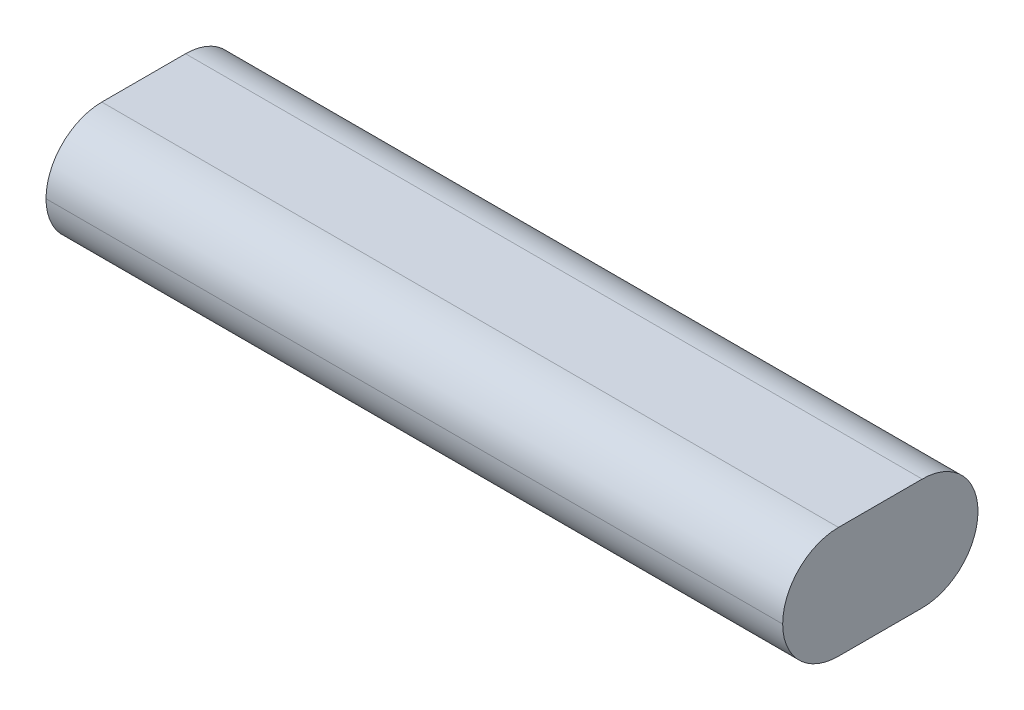
ISO-10303-21;
HEADER;
FILE_DESCRIPTION(('STEP AP214'),'2;1');
FILE_NAME('part.step','',(''),(''),'','','');
FILE_SCHEMA(('AUTOMOTIVE_DESIGN { 1 0 10303 214 1 1 1 1 }'));
ENDSEC;
DATA;
#1=APPLICATION_CONTEXT('core data for automotive mechanical design processes');
#2=APPLICATION_PROTOCOL_DEFINITION('international standard','automotive_design',2000,#1);
#3=PRODUCT_CONTEXT('',#1,'mechanical');
#4=PRODUCT('Part','Part','',(#3));
#5=PRODUCT_RELATED_PRODUCT_CATEGORY('part','',(#4));
#6=PRODUCT_DEFINITION_FORMATION('','',#4);
#7=PRODUCT_DEFINITION_CONTEXT('part definition',#1,'design');
#8=PRODUCT_DEFINITION('design','',#6,#7);
#9=PRODUCT_DEFINITION_SHAPE('','',#8);
#10=(LENGTH_UNIT() NAMED_UNIT(*) SI_UNIT(.MILLI.,.METRE.));
#11=(NAMED_UNIT(*) PLANE_ANGLE_UNIT() SI_UNIT($,.RADIAN.));
#12=(NAMED_UNIT(*) SI_UNIT($,.STERADIAN.) SOLID_ANGLE_UNIT());
#13=UNCERTAINTY_MEASURE_WITH_UNIT(LENGTH_MEASURE(1.E-05),#10,'distance_accuracy_value','');
#14=(GEOMETRIC_REPRESENTATION_CONTEXT(3) GLOBAL_UNCERTAINTY_ASSIGNED_CONTEXT((#13)) GLOBAL_UNIT_ASSIGNED_CONTEXT((#10,
#11,#12)) REPRESENTATION_CONTEXT('',''));
#15=CARTESIAN_POINT('',(0.,0.,0.));
#16=DIRECTION('',(0.,0.,1.));
#17=DIRECTION('',(1.,0.,0.));
#18=AXIS2_PLACEMENT_3D('',#15,#16,#17);
#19=CARTESIAN_POINT('',(-87.7694560024657,20.,5.27069157760192));
#20=DIRECTION('',(1.,0.,0.));
#21=DIRECTION('',(0.,0.,-1.));
#22=AXIS2_PLACEMENT_3D('',#19,#20,#21);
#23=PLANE('',#22);
#24=CARTESIAN_POINT('',(-87.7694560024657,10.,15.2706915776019));
#25=DIRECTION('',(1.,0.,0.));
#26=DIRECTION('',(0.,0.,-1.));
#27=AXIS2_PLACEMENT_3D('',#24,#25,#26);
#28=CIRCLE('',#27,10.);
#29=CARTESIAN_POINT('',(-87.7694560024657,20.,15.2706915776019));
#30=VERTEX_POINT('',#29);
#31=CARTESIAN_POINT('',(-87.7694560024657,10.,5.27069157760192));
#32=VERTEX_POINT('',#31);
#33=EDGE_CURVE('E57',#30,#32,#28,.F.);
#34=ORIENTED_EDGE('',*,*,#33,.T.);
#35=CARTESIAN_POINT('',(-87.7694560024657,10.,15.2706915776019));
#36=DIRECTION('',(1.,0.,0.));
#37=DIRECTION('',(0.,0.,-1.));
#38=AXIS2_PLACEMENT_3D('',#35,#36,#37);
#39=CIRCLE('',#38,10.);
#40=CARTESIAN_POINT('',(-87.7694560024657,0.,15.2706915776019));
#41=VERTEX_POINT('',#40);
#42=EDGE_CURVE('E136',#32,#41,#39,.F.);
#43=ORIENTED_EDGE('',*,*,#42,.T.);
#44=DIRECTION('',(0.,0.,1.));
#45=VECTOR('',#44,1.);
#46=CARTESIAN_POINT('',(-87.7694560024657,0.,5.27069157760192));
#47=LINE('',#46,#45);
#48=CARTESIAN_POINT('',(-87.7694560024657,0.,30.2706915776019));
#49=VERTEX_POINT('',#48);
#50=EDGE_CURVE('E119',#41,#49,#47,.T.);
#51=ORIENTED_EDGE('',*,*,#50,.T.);
#52=CARTESIAN_POINT('',(-87.7694560024657,10.,30.2706915776019));
#53=DIRECTION('',(1.,0.,0.));
#54=DIRECTION('',(0.,0.,-1.));
#55=AXIS2_PLACEMENT_3D('',#52,#53,#54);
#56=CIRCLE('',#55,10.);
#57=CARTESIAN_POINT('',(-87.7694560024657,10.,40.2706915776019));
#58=VERTEX_POINT('',#57);
#59=EDGE_CURVE('E122',#49,#58,#56,.F.);
#60=ORIENTED_EDGE('',*,*,#59,.T.);
#61=CARTESIAN_POINT('',(-87.7694560024657,10.,30.2706915776019));
#62=DIRECTION('',(1.,0.,0.));
#63=DIRECTION('',(0.,0.,-1.));
#64=AXIS2_PLACEMENT_3D('',#61,#62,#63);
#65=CIRCLE('',#64,10.);
#66=CARTESIAN_POINT('',(-87.7694560024657,20.,30.2706915776019));
#67=VERTEX_POINT('',#66);
#68=EDGE_CURVE('E63',#58,#67,#65,.F.);
#69=ORIENTED_EDGE('',*,*,#68,.T.);
#70=DIRECTION('',(0.,0.,1.));
#71=VECTOR('',#70,1.);
#72=CARTESIAN_POINT('',(-87.7694560024657,20.,5.27069157760192));
#73=LINE('',#72,#71);
#74=EDGE_CURVE('E118',#30,#67,#73,.T.);
#75=ORIENTED_EDGE('',*,*,#74,.F.);
#76=EDGE_LOOP('',(#34,#43,#51,#60,#69,#75));
#77=FACE_BOUND('',#76,.T.);
#78=ADVANCED_FACE('F39',(#77),#23,.F.);
#79=CARTESIAN_POINT('',(44.2305439975343,20.,5.27069157760192));
#80=DIRECTION('',(-1.,0.,0.));
#81=DIRECTION('',(0.,0.,1.));
#82=AXIS2_PLACEMENT_3D('',#79,#80,#81);
#83=PLANE('',#82);
#84=DIRECTION('',(0.,0.,-1.));
#85=VECTOR('',#84,1.);
#86=CARTESIAN_POINT('',(44.2305439975343,0.,5.27069157760192));
#87=LINE('',#86,#85);
#88=CARTESIAN_POINT('',(44.2305439975343,0.,30.2706915776019));
#89=VERTEX_POINT('',#88);
#90=CARTESIAN_POINT('',(44.2305439975343,0.,15.2706915776019));
#91=VERTEX_POINT('',#90);
#92=EDGE_CURVE('E97',#89,#91,#87,.T.);
#93=ORIENTED_EDGE('',*,*,#92,.T.);
#94=CARTESIAN_POINT('',(44.2305439975343,10.,15.2706915776019));
#95=DIRECTION('',(-1.,0.,0.));
#96=DIRECTION('',(0.,0.,1.));
#97=AXIS2_PLACEMENT_3D('',#94,#95,#96);
#98=CIRCLE('',#97,10.);
#99=CARTESIAN_POINT('',(44.2305439975343,10.,5.27069157760192));
#100=VERTEX_POINT('',#99);
#101=EDGE_CURVE('E128',#91,#100,#98,.F.);
#102=ORIENTED_EDGE('',*,*,#101,.T.);
#103=CARTESIAN_POINT('',(44.2305439975343,10.,15.2706915776019));
#104=DIRECTION('',(-1.,0.,0.));
#105=DIRECTION('',(0.,0.,1.));
#106=AXIS2_PLACEMENT_3D('',#103,#104,#105);
#107=CIRCLE('',#106,10.);
#108=CARTESIAN_POINT('',(44.2305439975343,20.,15.2706915776019));
#109=VERTEX_POINT('',#108);
#110=EDGE_CURVE('E106',#100,#109,#107,.F.);
#111=ORIENTED_EDGE('',*,*,#110,.T.);
#112=DIRECTION('',(0.,0.,-1.));
#113=VECTOR('',#112,1.);
#114=CARTESIAN_POINT('',(44.2305439975343,20.,5.27069157760192));
#115=LINE('',#114,#113);
#116=CARTESIAN_POINT('',(44.2305439975343,20.,30.2706915776019));
#117=VERTEX_POINT('',#116);
#118=EDGE_CURVE('E158',#117,#109,#115,.T.);
#119=ORIENTED_EDGE('',*,*,#118,.F.);
#120=CARTESIAN_POINT('',(44.2305439975343,10.,30.2706915776019));
#121=DIRECTION('',(-1.,0.,0.));
#122=DIRECTION('',(0.,0.,1.));
#123=AXIS2_PLACEMENT_3D('',#120,#121,#122);
#124=CIRCLE('',#123,10.);
#125=CARTESIAN_POINT('',(44.2305439975343,10.,40.2706915776019));
#126=VERTEX_POINT('',#125);
#127=EDGE_CURVE('E100',#117,#126,#124,.F.);
#128=ORIENTED_EDGE('',*,*,#127,.T.);
#129=CARTESIAN_POINT('',(44.2305439975343,10.,30.2706915776019));
#130=DIRECTION('',(-1.,0.,0.));
#131=DIRECTION('',(0.,0.,1.));
#132=AXIS2_PLACEMENT_3D('',#129,#130,#131);
#133=CIRCLE('',#132,10.);
#134=EDGE_CURVE('E94',#126,#89,#133,.F.);
#135=ORIENTED_EDGE('',*,*,#134,.T.);
#136=EDGE_LOOP('',(#93,#102,#111,#119,#128,#135));
#137=FACE_BOUND('',#136,.T.);
#138=ADVANCED_FACE('F96',(#137),#83,.F.);
#139=CARTESIAN_POINT('',(0.,20.,0.));
#140=DIRECTION('',(0.,1.,0.));
#141=DIRECTION('',(0.,0.,1.));
#142=AXIS2_PLACEMENT_3D('',#139,#140,#141);
#143=PLANE('',#142);
#144=ORIENTED_EDGE('',*,*,#118,.T.);
#145=DIRECTION('',(-1.,0.,0.));
#146=VECTOR('',#145,1.);
#147=CARTESIAN_POINT('',(-87.7694560024657,20.,15.2706915776019));
#148=LINE('',#147,#146);
#149=EDGE_CURVE('E11',#109,#30,#148,.T.);
#150=ORIENTED_EDGE('',*,*,#149,.T.);
#151=ORIENTED_EDGE('',*,*,#74,.T.);
#152=DIRECTION('',(1.,0.,0.));
#153=VECTOR('',#152,1.);
#154=CARTESIAN_POINT('',(44.2305439975343,20.,30.2706915776019));
#155=LINE('',#154,#153);
#156=EDGE_CURVE('E49',#67,#117,#155,.T.);
#157=ORIENTED_EDGE('',*,*,#156,.T.);
#158=EDGE_LOOP('',(#144,#150,#151,#157));
#159=FACE_BOUND('',#158,.T.);
#160=ADVANCED_FACE('F165',(#159),#143,.T.);
#161=CARTESIAN_POINT('',(0.,0.,0.));
#162=DIRECTION('',(0.,1.,0.));
#163=DIRECTION('',(0.,0.,1.));
#164=AXIS2_PLACEMENT_3D('',#161,#162,#163);
#165=PLANE('',#164);
#166=ORIENTED_EDGE('',*,*,#92,.F.);
#167=DIRECTION('',(1.,0.,0.));
#168=VECTOR('',#167,1.);
#169=CARTESIAN_POINT('',(0.,0.,30.2706915776019));
#170=LINE('',#169,#168);
#171=EDGE_CURVE('E113',#89,#49,#170,.F.);
#172=ORIENTED_EDGE('',*,*,#171,.T.);
#173=ORIENTED_EDGE('',*,*,#50,.F.);
#174=DIRECTION('',(-1.,0.,0.));
#175=VECTOR('',#174,1.);
#176=CARTESIAN_POINT('',(0.,0.,15.2706915776019));
#177=LINE('',#176,#175);
#178=EDGE_CURVE('E116',#41,#91,#177,.F.);
#179=ORIENTED_EDGE('',*,*,#178,.T.);
#180=EDGE_LOOP('',(#166,#172,#173,#179));
#181=FACE_BOUND('',#180,.T.);
#182=ADVANCED_FACE('F111',(#181),#165,.F.);
#183=CARTESIAN_POINT('',(0.,10.,30.2706915776019));
#184=DIRECTION('',(-1.,0.,0.));
#185=DIRECTION('',(0.,0.,1.));
#186=AXIS2_PLACEMENT_3D('',#183,#184,#185);
#187=CYLINDRICAL_SURFACE('',#186,10.);
#188=ORIENTED_EDGE('',*,*,#156,.F.);
#189=ORIENTED_EDGE('',*,*,#68,.F.);
#190=DIRECTION('',(1.,0.,0.));
#191=VECTOR('',#190,1.);
#192=CARTESIAN_POINT('',(-87.7694560024657,10.,40.2706915776019));
#193=LINE('',#192,#191);
#194=EDGE_CURVE('E140',#126,#58,#193,.F.);
#195=ORIENTED_EDGE('',*,*,#194,.F.);
#196=ORIENTED_EDGE('',*,*,#127,.F.);
#197=EDGE_LOOP('',(#188,#189,#195,#196));
#198=FACE_BOUND('',#197,.T.);
#199=ADVANCED_FACE('F167',(#198),#187,.T.);
#200=CARTESIAN_POINT('',(-87.7694560024657,10.,30.2706915776019));
#201=DIRECTION('',(1.,0.,0.));
#202=DIRECTION('',(0.,0.,-1.));
#203=AXIS2_PLACEMENT_3D('',#200,#201,#202);
#204=CYLINDRICAL_SURFACE('',#203,10.);
#205=ORIENTED_EDGE('',*,*,#59,.F.);
#206=ORIENTED_EDGE('',*,*,#171,.F.);
#207=ORIENTED_EDGE('',*,*,#134,.F.);
#208=ORIENTED_EDGE('',*,*,#194,.T.);
#209=EDGE_LOOP('',(#205,#206,#207,#208));
#210=FACE_BOUND('',#209,.T.);
#211=ADVANCED_FACE('F121',(#210),#204,.T.);
#212=CARTESIAN_POINT('',(0.,10.,15.2706915776019));
#213=DIRECTION('',(1.,0.,0.));
#214=DIRECTION('',(0.,0.,-1.));
#215=AXIS2_PLACEMENT_3D('',#212,#213,#214);
#216=CYLINDRICAL_SURFACE('',#215,10.);
#217=ORIENTED_EDGE('',*,*,#149,.F.);
#218=ORIENTED_EDGE('',*,*,#110,.F.);
#219=DIRECTION('',(-1.,0.,0.));
#220=VECTOR('',#219,1.);
#221=CARTESIAN_POINT('',(44.2305439975343,10.,5.27069157760192));
#222=LINE('',#221,#220);
#223=EDGE_CURVE('E43',#32,#100,#222,.F.);
#224=ORIENTED_EDGE('',*,*,#223,.F.);
#225=ORIENTED_EDGE('',*,*,#33,.F.);
#226=EDGE_LOOP('',(#217,#218,#224,#225));
#227=FACE_BOUND('',#226,.T.);
#228=ADVANCED_FACE('F41',(#227),#216,.T.);
#229=CARTESIAN_POINT('',(-87.7694560024657,10.,15.2706915776019));
#230=DIRECTION('',(-1.,0.,0.));
#231=DIRECTION('',(0.,0.,1.));
#232=AXIS2_PLACEMENT_3D('',#229,#230,#231);
#233=CYLINDRICAL_SURFACE('',#232,10.);
#234=ORIENTED_EDGE('',*,*,#101,.F.);
#235=ORIENTED_EDGE('',*,*,#178,.F.);
#236=ORIENTED_EDGE('',*,*,#42,.F.);
#237=ORIENTED_EDGE('',*,*,#223,.T.);
#238=EDGE_LOOP('',(#234,#235,#236,#237));
#239=FACE_BOUND('',#238,.T.);
#240=ADVANCED_FACE('F148',(#239),#233,.T.);
#241=CLOSED_SHELL('',(#78,#138,#160,#182,#199,#211,#228,#240));
#242=MANIFOLD_SOLID_BREP('B2',#241);
#243=ADVANCED_BREP_SHAPE_REPRESENTATION('',(#18,#242),#14);
#244=SHAPE_DEFINITION_REPRESENTATION(#9,#243);
ENDSEC;
END-ISO-10303-21;
